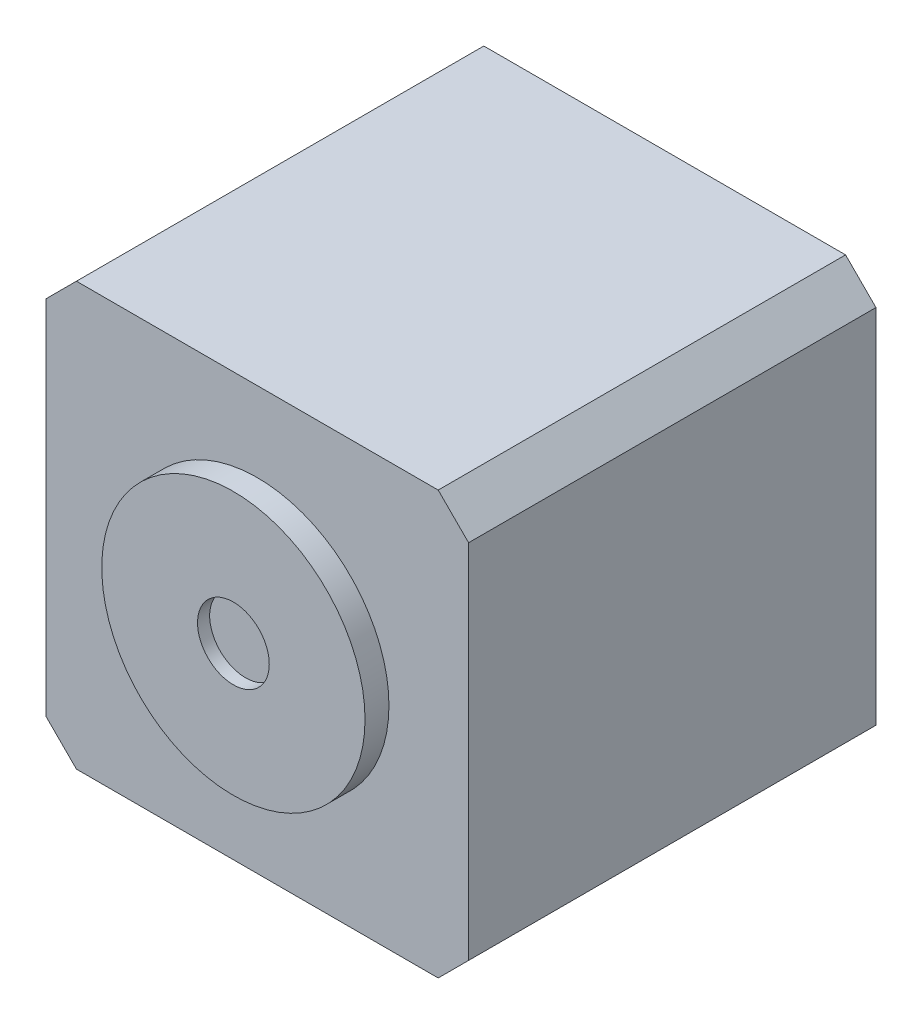
ISO-10303-21;
HEADER;
FILE_DESCRIPTION(('STEP AP214'),'2;1');
FILE_NAME('part.step','',(''),(''),'','','');
FILE_SCHEMA(('AUTOMOTIVE_DESIGN { 1 0 10303 214 1 1 1 1 }'));
ENDSEC;
DATA;
#1=APPLICATION_CONTEXT('core data for automotive mechanical design processes');
#2=APPLICATION_PROTOCOL_DEFINITION('international standard','automotive_design',2000,#1);
#3=PRODUCT_CONTEXT('',#1,'mechanical');
#4=PRODUCT('Part','Part','',(#3));
#5=PRODUCT_RELATED_PRODUCT_CATEGORY('part','',(#4));
#6=PRODUCT_DEFINITION_FORMATION('','',#4);
#7=PRODUCT_DEFINITION_CONTEXT('part definition',#1,'design');
#8=PRODUCT_DEFINITION('design','',#6,#7);
#9=PRODUCT_DEFINITION_SHAPE('','',#8);
#10=(LENGTH_UNIT() NAMED_UNIT(*) SI_UNIT(.MILLI.,.METRE.));
#11=(NAMED_UNIT(*) PLANE_ANGLE_UNIT() SI_UNIT($,.RADIAN.));
#12=(NAMED_UNIT(*) SI_UNIT($,.STERADIAN.) SOLID_ANGLE_UNIT());
#13=UNCERTAINTY_MEASURE_WITH_UNIT(LENGTH_MEASURE(1.E-05),#10,'distance_accuracy_value','');
#14=(GEOMETRIC_REPRESENTATION_CONTEXT(3) GLOBAL_UNCERTAINTY_ASSIGNED_CONTEXT((#13)) GLOBAL_UNIT_ASSIGNED_CONTEXT((#10,
#11,#12)) REPRESENTATION_CONTEXT('',''));
#15=CARTESIAN_POINT('',(0.,0.,0.));
#16=DIRECTION('',(0.,0.,1.));
#17=DIRECTION('',(1.,0.,0.));
#18=AXIS2_PLACEMENT_3D('',#15,#16,#17);
#19=CARTESIAN_POINT('',(-17.653,-17.653,34.036));
#20=DIRECTION('',(1.,0.,0.));
#21=DIRECTION('',(0.,0.,-1.));
#22=AXIS2_PLACEMENT_3D('',#19,#20,#21);
#23=PLANE('',#22);
#24=DIRECTION('',(0.,-1.,0.));
#25=VECTOR('',#24,1.);
#26=CARTESIAN_POINT('',(-17.653,-17.653,34.036));
#27=LINE('',#26,#25);
#28=CARTESIAN_POINT('',(-17.653,15.113,34.036));
#29=VERTEX_POINT('',#28);
#30=CARTESIAN_POINT('',(-17.653,-15.113,34.036));
#31=VERTEX_POINT('',#30);
#32=EDGE_CURVE('E127',#29,#31,#27,.T.);
#33=ORIENTED_EDGE('',*,*,#32,.F.);
#34=DIRECTION('',(0.,0.,-1.));
#35=VECTOR('',#34,1.);
#36=CARTESIAN_POINT('',(-17.653,15.113,34.036));
#37=LINE('',#36,#35);
#38=CARTESIAN_POINT('',(-17.653,15.113,0.));
#39=VERTEX_POINT('',#38);
#40=EDGE_CURVE('E112',#29,#39,#37,.T.);
#41=ORIENTED_EDGE('',*,*,#40,.T.);
#42=DIRECTION('',(0.,-1.,0.));
#43=VECTOR('',#42,1.);
#44=CARTESIAN_POINT('',(-17.653,-17.653,0.));
#45=LINE('',#44,#43);
#46=CARTESIAN_POINT('',(-17.653,-15.113,0.));
#47=VERTEX_POINT('',#46);
#48=EDGE_CURVE('E124',#39,#47,#45,.T.);
#49=ORIENTED_EDGE('',*,*,#48,.T.);
#50=DIRECTION('',(0.,0.,1.));
#51=VECTOR('',#50,1.);
#52=CARTESIAN_POINT('',(-17.653,-15.113,34.036));
#53=LINE('',#52,#51);
#54=EDGE_CURVE('E129',#47,#31,#53,.T.);
#55=ORIENTED_EDGE('',*,*,#54,.T.);
#56=EDGE_LOOP('',(#33,#41,#49,#55));
#57=FACE_BOUND('',#56,.T.);
#58=ADVANCED_FACE('F41',(#57),#23,.F.);
#59=CARTESIAN_POINT('',(17.653,-17.653,34.036));
#60=DIRECTION('',(0.,1.,0.));
#61=DIRECTION('',(-1.,0.,0.));
#62=AXIS2_PLACEMENT_3D('',#59,#60,#61);
#63=PLANE('',#62);
#64=DIRECTION('',(1.,0.,0.));
#65=VECTOR('',#64,1.);
#66=CARTESIAN_POINT('',(17.653,-17.653,0.));
#67=LINE('',#66,#65);
#68=CARTESIAN_POINT('',(-15.113,-17.653,0.));
#69=VERTEX_POINT('',#68);
#70=CARTESIAN_POINT('',(15.113,-17.653,0.));
#71=VERTEX_POINT('',#70);
#72=EDGE_CURVE('E133',#69,#71,#67,.T.);
#73=ORIENTED_EDGE('',*,*,#72,.T.);
#74=DIRECTION('',(0.,0.,1.));
#75=VECTOR('',#74,1.);
#76=CARTESIAN_POINT('',(15.113,-17.653,34.036));
#77=LINE('',#76,#75);
#78=CARTESIAN_POINT('',(15.113,-17.653,34.036));
#79=VERTEX_POINT('',#78);
#80=EDGE_CURVE('E11',#71,#79,#77,.T.);
#81=ORIENTED_EDGE('',*,*,#80,.T.);
#82=DIRECTION('',(1.,0.,0.));
#83=VECTOR('',#82,1.);
#84=CARTESIAN_POINT('',(17.653,-17.653,34.036));
#85=LINE('',#84,#83);
#86=CARTESIAN_POINT('',(-15.113,-17.653,34.036));
#87=VERTEX_POINT('',#86);
#88=EDGE_CURVE('E174',#87,#79,#85,.T.);
#89=ORIENTED_EDGE('',*,*,#88,.F.);
#90=DIRECTION('',(0.,0.,-1.));
#91=VECTOR('',#90,1.);
#92=CARTESIAN_POINT('',(-15.113,-17.653,34.036));
#93=LINE('',#92,#91);
#94=EDGE_CURVE('E50',#87,#69,#93,.T.);
#95=ORIENTED_EDGE('',*,*,#94,.T.);
#96=EDGE_LOOP('',(#73,#81,#89,#95));
#97=FACE_BOUND('',#96,.T.);
#98=ADVANCED_FACE('F172',(#97),#63,.F.);
#99=CARTESIAN_POINT('',(17.653,-17.653,34.036));
#100=DIRECTION('',(-1.,0.,0.));
#101=DIRECTION('',(0.,0.,1.));
#102=AXIS2_PLACEMENT_3D('',#99,#100,#101);
#103=PLANE('',#102);
#104=DIRECTION('',(0.,1.,0.));
#105=VECTOR('',#104,1.);
#106=CARTESIAN_POINT('',(17.653,-17.653,0.));
#107=LINE('',#106,#105);
#108=CARTESIAN_POINT('',(17.653,-15.113,0.));
#109=VERTEX_POINT('',#108);
#110=CARTESIAN_POINT('',(17.653,15.113,0.));
#111=VERTEX_POINT('',#110);
#112=EDGE_CURVE('E137',#109,#111,#107,.T.);
#113=ORIENTED_EDGE('',*,*,#112,.T.);
#114=DIRECTION('',(0.,0.,1.));
#115=VECTOR('',#114,1.);
#116=CARTESIAN_POINT('',(17.653,15.113,34.036));
#117=LINE('',#116,#115);
#118=CARTESIAN_POINT('',(17.653,15.113,34.036));
#119=VERTEX_POINT('',#118);
#120=EDGE_CURVE('E57',#111,#119,#117,.T.);
#121=ORIENTED_EDGE('',*,*,#120,.T.);
#122=DIRECTION('',(0.,1.,0.));
#123=VECTOR('',#122,1.);
#124=CARTESIAN_POINT('',(17.653,-17.653,34.036));
#125=LINE('',#124,#123);
#126=CARTESIAN_POINT('',(17.653,-15.113,34.036));
#127=VERTEX_POINT('',#126);
#128=EDGE_CURVE('E182',#127,#119,#125,.T.);
#129=ORIENTED_EDGE('',*,*,#128,.F.);
#130=DIRECTION('',(0.,0.,-1.));
#131=VECTOR('',#130,1.);
#132=CARTESIAN_POINT('',(17.653,-15.113,34.036));
#133=LINE('',#132,#131);
#134=EDGE_CURVE('E165',#127,#109,#133,.T.);
#135=ORIENTED_EDGE('',*,*,#134,.T.);
#136=EDGE_LOOP('',(#113,#121,#129,#135));
#137=FACE_BOUND('',#136,.T.);
#138=ADVANCED_FACE('F181',(#137),#103,.F.);
#139=CARTESIAN_POINT('',(17.653,17.653,34.036));
#140=DIRECTION('',(0.,-1.,0.));
#141=DIRECTION('',(1.,0.,0.));
#142=AXIS2_PLACEMENT_3D('',#139,#140,#141);
#143=PLANE('',#142);
#144=DIRECTION('',(-1.,0.,0.));
#145=VECTOR('',#144,1.);
#146=CARTESIAN_POINT('',(17.653,17.653,0.));
#147=LINE('',#146,#145);
#148=CARTESIAN_POINT('',(15.113,17.653,0.));
#149=VERTEX_POINT('',#148);
#150=CARTESIAN_POINT('',(-15.113,17.653,0.));
#151=VERTEX_POINT('',#150);
#152=EDGE_CURVE('E147',#149,#151,#147,.T.);
#153=ORIENTED_EDGE('',*,*,#152,.T.);
#154=DIRECTION('',(0.,0.,1.));
#155=VECTOR('',#154,1.);
#156=CARTESIAN_POINT('',(-15.113,17.653,34.036));
#157=LINE('',#156,#155);
#158=CARTESIAN_POINT('',(-15.113,17.653,34.036));
#159=VERTEX_POINT('',#158);
#160=EDGE_CURVE('E113',#151,#159,#157,.T.);
#161=ORIENTED_EDGE('',*,*,#160,.T.);
#162=DIRECTION('',(-1.,0.,0.));
#163=VECTOR('',#162,1.);
#164=CARTESIAN_POINT('',(17.653,17.653,34.036));
#165=LINE('',#164,#163);
#166=CARTESIAN_POINT('',(15.113,17.653,34.036));
#167=VERTEX_POINT('',#166);
#168=EDGE_CURVE('E143',#167,#159,#165,.T.);
#169=ORIENTED_EDGE('',*,*,#168,.F.);
#170=DIRECTION('',(0.,0.,-1.));
#171=VECTOR('',#170,1.);
#172=CARTESIAN_POINT('',(15.113,17.653,34.036));
#173=LINE('',#172,#171);
#174=EDGE_CURVE('E118',#167,#149,#173,.T.);
#175=ORIENTED_EDGE('',*,*,#174,.T.);
#176=EDGE_LOOP('',(#153,#161,#169,#175));
#177=FACE_BOUND('',#176,.T.);
#178=ADVANCED_FACE('F218',(#177),#143,.F.);
#179=CARTESIAN_POINT('',(0.,0.,34.036));
#180=DIRECTION('',(0.,0.,1.));
#181=DIRECTION('',(1.,0.,0.));
#182=AXIS2_PLACEMENT_3D('',#179,#180,#181);
#183=PLANE('',#182);
#184=CARTESIAN_POINT('',(0.,0.,34.036));
#185=DIRECTION('',(0.,0.,1.));
#186=DIRECTION('',(1.,0.,0.));
#187=AXIS2_PLACEMENT_3D('',#184,#185,#186);
#188=CIRCLE('',#187,10.9982);
#189=CARTESIAN_POINT('',(10.9982,0.,34.036));
#190=VERTEX_POINT('',#189);
#191=EDGE_CURVE('E149',#190,#190,#188,.T.);
#192=ORIENTED_EDGE('',*,*,#191,.F.);
#193=EDGE_LOOP('',(#192));
#194=FACE_BOUND('',#193,.T.);
#195=ORIENTED_EDGE('',*,*,#168,.T.);
#196=DIRECTION('',(0.707106781186549,0.707106781186546,0.));
#197=VECTOR('',#196,1.);
#198=CARTESIAN_POINT('',(-16.383,16.383,34.036));
#199=LINE('',#198,#197);
#200=EDGE_CURVE('E163',#159,#29,#199,.F.);
#201=ORIENTED_EDGE('',*,*,#200,.T.);
#202=ORIENTED_EDGE('',*,*,#32,.T.);
#203=DIRECTION('',(-0.707106781186545,0.70710678118655,0.));
#204=VECTOR('',#203,1.);
#205=CARTESIAN_POINT('',(-16.3830000000001,-16.3829999999999,34.036));
#206=LINE('',#205,#204);
#207=EDGE_CURVE('E158',#31,#87,#206,.F.);
#208=ORIENTED_EDGE('',*,*,#207,.T.);
#209=ORIENTED_EDGE('',*,*,#88,.T.);
#210=DIRECTION('',(-0.707106781186548,-0.707106781186547,0.));
#211=VECTOR('',#210,1.);
#212=CARTESIAN_POINT('',(16.383,-16.383,34.036));
#213=LINE('',#212,#211);
#214=EDGE_CURVE('E64',#79,#127,#213,.F.);
#215=ORIENTED_EDGE('',*,*,#214,.T.);
#216=ORIENTED_EDGE('',*,*,#128,.T.);
#217=DIRECTION('',(0.707106781186547,-0.707106781186548,0.));
#218=VECTOR('',#217,1.);
#219=CARTESIAN_POINT('',(16.383,16.383,34.036));
#220=LINE('',#219,#218);
#221=EDGE_CURVE('E161',#119,#167,#220,.F.);
#222=ORIENTED_EDGE('',*,*,#221,.T.);
#223=EDGE_LOOP('',(#195,#201,#202,#208,#209,#215,#216,#222));
#224=FACE_BOUND('',#223,.T.);
#225=ADVANCED_FACE('F216',(#194,#224),#183,.T.);
#226=CARTESIAN_POINT('',(0.,0.,0.));
#227=DIRECTION('',(0.,0.,1.));
#228=DIRECTION('',(1.,0.,0.));
#229=AXIS2_PLACEMENT_3D('',#226,#227,#228);
#230=PLANE('',#229);
#231=ORIENTED_EDGE('',*,*,#48,.F.);
#232=DIRECTION('',(-0.707106781186549,-0.707106781186546,0.));
#233=VECTOR('',#232,1.);
#234=CARTESIAN_POINT('',(-17.653,15.113,0.));
#235=LINE('',#234,#233);
#236=EDGE_CURVE('E108',#39,#151,#235,.F.);
#237=ORIENTED_EDGE('',*,*,#236,.T.);
#238=ORIENTED_EDGE('',*,*,#152,.F.);
#239=DIRECTION('',(-0.707106781186547,0.707106781186548,0.));
#240=VECTOR('',#239,1.);
#241=CARTESIAN_POINT('',(15.113,17.653,0.));
#242=LINE('',#241,#240);
#243=EDGE_CURVE('E119',#149,#111,#242,.F.);
#244=ORIENTED_EDGE('',*,*,#243,.T.);
#245=ORIENTED_EDGE('',*,*,#112,.F.);
#246=DIRECTION('',(0.707106781186548,0.707106781186547,0.));
#247=VECTOR('',#246,1.);
#248=CARTESIAN_POINT('',(17.653,-15.113,0.));
#249=LINE('',#248,#247);
#250=EDGE_CURVE('E152',#109,#71,#249,.F.);
#251=ORIENTED_EDGE('',*,*,#250,.T.);
#252=ORIENTED_EDGE('',*,*,#72,.F.);
#253=DIRECTION('',(0.707106781186545,-0.70710678118655,0.));
#254=VECTOR('',#253,1.);
#255=CARTESIAN_POINT('',(-15.113,-17.653,0.));
#256=LINE('',#255,#254);
#257=EDGE_CURVE('E128',#69,#47,#256,.F.);
#258=ORIENTED_EDGE('',*,*,#257,.T.);
#259=EDGE_LOOP('',(#231,#237,#238,#244,#245,#251,#252,#258));
#260=FACE_BOUND('',#259,.T.);
#261=ADVANCED_FACE('F131',(#260),#230,.F.);
#262=CARTESIAN_POINT('',(0.,0.,36.03498));
#263=DIRECTION('',(0.,0.,-1.));
#264=DIRECTION('',(-1.,0.,0.));
#265=AXIS2_PLACEMENT_3D('',#262,#263,#264);
#266=CYLINDRICAL_SURFACE('',#265,10.9982);
#267=CARTESIAN_POINT('',(0.,0.,36.03498));
#268=DIRECTION('',(0.,0.,1.));
#269=DIRECTION('',(1.,0.,0.));
#270=AXIS2_PLACEMENT_3D('',#267,#268,#269);
#271=CIRCLE('',#270,10.9982);
#272=CARTESIAN_POINT('',(10.9982,0.,36.03498));
#273=VERTEX_POINT('',#272);
#274=EDGE_CURVE('E134',#273,#273,#271,.T.);
#275=ORIENTED_EDGE('',*,*,#274,.F.);
#276=EDGE_LOOP('',(#275));
#277=FACE_BOUND('',#276,.T.);
#278=ORIENTED_EDGE('',*,*,#191,.T.);
#279=EDGE_LOOP('',(#278));
#280=FACE_BOUND('',#279,.T.);
#281=ADVANCED_FACE('F207',(#277,#280),#266,.T.);
#282=CARTESIAN_POINT('',(0.,0.,36.03498));
#283=DIRECTION('',(0.,0.,1.));
#284=DIRECTION('',(1.,0.,0.));
#285=AXIS2_PLACEMENT_3D('',#282,#283,#284);
#286=PLANE('',#285);
#287=CARTESIAN_POINT('',(0.,0.,36.03498));
#288=DIRECTION('',(0.,0.,1.));
#289=DIRECTION('',(1.,0.,0.));
#290=AXIS2_PLACEMENT_3D('',#287,#288,#289);
#291=CIRCLE('',#290,2.9972);
#292=CARTESIAN_POINT('',(2.9972,0.,36.03498));
#293=VERTEX_POINT('',#292);
#294=EDGE_CURVE('E190',#293,#293,#291,.T.);
#295=ORIENTED_EDGE('',*,*,#294,.F.);
#296=EDGE_LOOP('',(#295));
#297=FACE_BOUND('',#296,.T.);
#298=ORIENTED_EDGE('',*,*,#274,.T.);
#299=EDGE_LOOP('',(#298));
#300=FACE_BOUND('',#299,.T.);
#301=ADVANCED_FACE('F201',(#297,#300),#286,.T.);
#302=CARTESIAN_POINT('',(0.,0.,35.01898));
#303=DIRECTION('',(0.,0.,1.));
#304=DIRECTION('',(1.,0.,0.));
#305=AXIS2_PLACEMENT_3D('',#302,#303,#304);
#306=CYLINDRICAL_SURFACE('',#305,2.9972);
#307=CARTESIAN_POINT('',(0.,0.,35.01898));
#308=DIRECTION('',(0.,0.,1.));
#309=DIRECTION('',(1.,0.,0.));
#310=AXIS2_PLACEMENT_3D('',#307,#308,#309);
#311=CIRCLE('',#310,2.9972);
#312=CARTESIAN_POINT('',(2.9972,0.,35.01898));
#313=VERTEX_POINT('',#312);
#314=EDGE_CURVE('E140',#313,#313,#311,.T.);
#315=ORIENTED_EDGE('',*,*,#314,.F.);
#316=EDGE_LOOP('',(#315));
#317=FACE_BOUND('',#316,.T.);
#318=ORIENTED_EDGE('',*,*,#294,.T.);
#319=EDGE_LOOP('',(#318));
#320=FACE_BOUND('',#319,.T.);
#321=ADVANCED_FACE('F198',(#317,#320),#306,.F.);
#322=CARTESIAN_POINT('',(0.,0.,35.01898));
#323=DIRECTION('',(0.,0.,1.));
#324=DIRECTION('',(1.,0.,0.));
#325=AXIS2_PLACEMENT_3D('',#322,#323,#324);
#326=PLANE('',#325);
#327=ORIENTED_EDGE('',*,*,#314,.T.);
#328=EDGE_LOOP('',(#327));
#329=FACE_BOUND('',#328,.T.);
#330=ADVANCED_FACE('F196',(#329),#326,.T.);
#331=CARTESIAN_POINT('',(-17.653,15.113,34.036));
#332=DIRECTION('',(0.707106781186546,-0.707106781186549,0.));
#333=DIRECTION('',(0.,0.,-1.));
#334=AXIS2_PLACEMENT_3D('',#331,#332,#333);
#335=PLANE('',#334);
#336=ORIENTED_EDGE('',*,*,#200,.F.);
#337=ORIENTED_EDGE('',*,*,#160,.F.);
#338=ORIENTED_EDGE('',*,*,#236,.F.);
#339=ORIENTED_EDGE('',*,*,#40,.F.);
#340=EDGE_LOOP('',(#336,#337,#338,#339));
#341=FACE_BOUND('',#340,.T.);
#342=ADVANCED_FACE('F111',(#341),#335,.F.);
#343=CARTESIAN_POINT('',(15.113,17.653,34.036));
#344=DIRECTION('',(-0.707106781186548,-0.707106781186547,0.));
#345=DIRECTION('',(0.,0.,-1.));
#346=AXIS2_PLACEMENT_3D('',#343,#344,#345);
#347=PLANE('',#346);
#348=ORIENTED_EDGE('',*,*,#221,.F.);
#349=ORIENTED_EDGE('',*,*,#120,.F.);
#350=ORIENTED_EDGE('',*,*,#243,.F.);
#351=ORIENTED_EDGE('',*,*,#174,.F.);
#352=EDGE_LOOP('',(#348,#349,#350,#351));
#353=FACE_BOUND('',#352,.T.);
#354=ADVANCED_FACE('F224',(#353),#347,.F.);
#355=CARTESIAN_POINT('',(17.653,-15.113,34.036));
#356=DIRECTION('',(-0.707106781186547,0.707106781186548,0.));
#357=DIRECTION('',(0.,0.,-1.));
#358=AXIS2_PLACEMENT_3D('',#355,#356,#357);
#359=PLANE('',#358);
#360=ORIENTED_EDGE('',*,*,#214,.F.);
#361=ORIENTED_EDGE('',*,*,#80,.F.);
#362=ORIENTED_EDGE('',*,*,#250,.F.);
#363=ORIENTED_EDGE('',*,*,#134,.F.);
#364=EDGE_LOOP('',(#360,#361,#362,#363));
#365=FACE_BOUND('',#364,.T.);
#366=ADVANCED_FACE('F180',(#365),#359,.F.);
#367=CARTESIAN_POINT('',(-15.113,-17.653,34.036));
#368=DIRECTION('',(0.70710678118655,0.707106781186545,0.));
#369=DIRECTION('',(0.,0.,-1.));
#370=AXIS2_PLACEMENT_3D('',#367,#368,#369);
#371=PLANE('',#370);
#372=ORIENTED_EDGE('',*,*,#207,.F.);
#373=ORIENTED_EDGE('',*,*,#54,.F.);
#374=ORIENTED_EDGE('',*,*,#257,.F.);
#375=ORIENTED_EDGE('',*,*,#94,.F.);
#376=EDGE_LOOP('',(#372,#373,#374,#375));
#377=FACE_BOUND('',#376,.T.);
#378=ADVANCED_FACE('F44',(#377),#371,.F.);
#379=CLOSED_SHELL('',(#58,#98,#138,#178,#225,#261,#281,#301,#321,#330,#342,#354,#366,#378));
#380=MANIFOLD_SOLID_BREP('B2',#379);
#381=ADVANCED_BREP_SHAPE_REPRESENTATION('',(#18,#380),#14);
#382=SHAPE_DEFINITION_REPRESENTATION(#9,#381);
ENDSEC;
END-ISO-10303-21;
